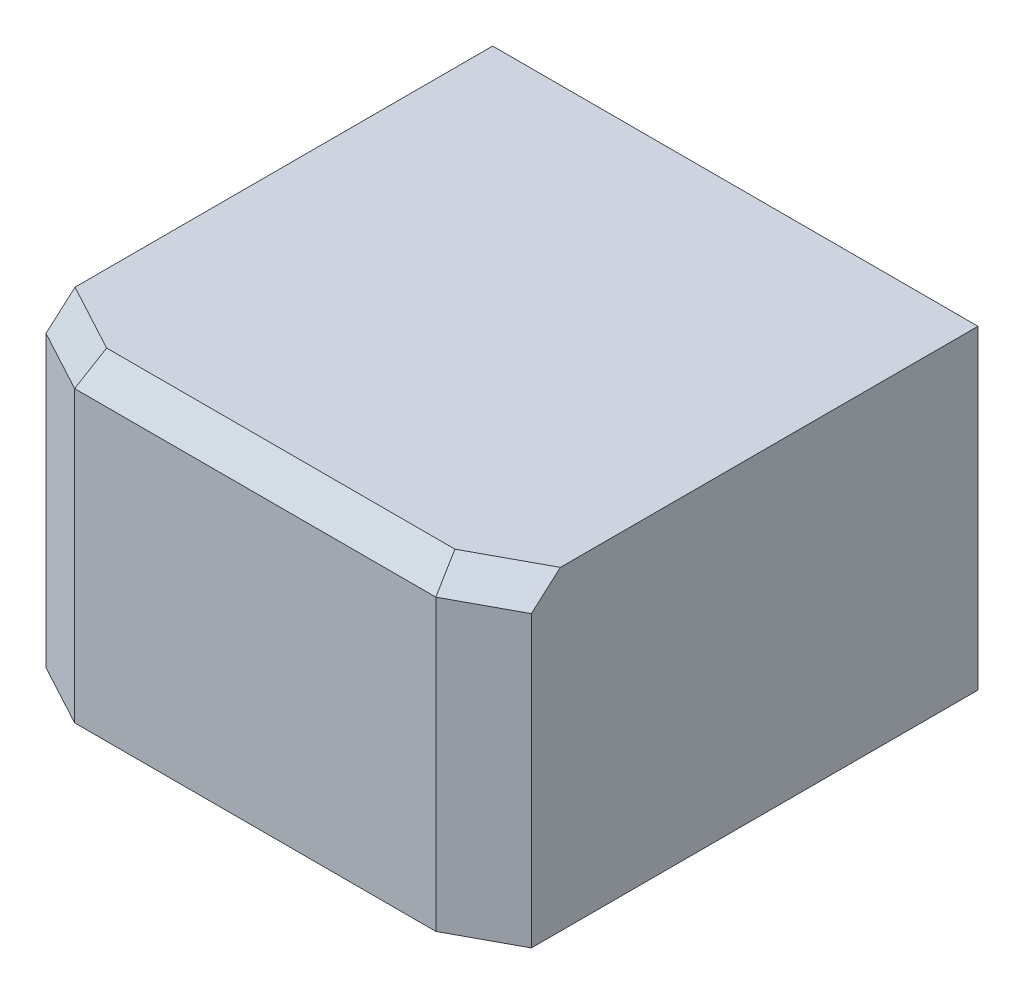
ISO-10303-21;
HEADER;
FILE_DESCRIPTION(('STEP AP214'),'2;1');
FILE_NAME('part.step','',(''),(''),'','','');
FILE_SCHEMA(('AUTOMOTIVE_DESIGN { 1 0 10303 214 1 1 1 1 }'));
ENDSEC;
DATA;
#1=APPLICATION_CONTEXT('core data for automotive mechanical design processes');
#2=APPLICATION_PROTOCOL_DEFINITION('international standard','automotive_design',2000,#1);
#3=PRODUCT_CONTEXT('',#1,'mechanical');
#4=PRODUCT('Part','Part','',(#3));
#5=PRODUCT_RELATED_PRODUCT_CATEGORY('part','',(#4));
#6=PRODUCT_DEFINITION_FORMATION('','',#4);
#7=PRODUCT_DEFINITION_CONTEXT('part definition',#1,'design');
#8=PRODUCT_DEFINITION('design','',#6,#7);
#9=PRODUCT_DEFINITION_SHAPE('','',#8);
#10=(LENGTH_UNIT() NAMED_UNIT(*) SI_UNIT(.MILLI.,.METRE.));
#11=(NAMED_UNIT(*) PLANE_ANGLE_UNIT() SI_UNIT($,.RADIAN.));
#12=(NAMED_UNIT(*) SI_UNIT($,.STERADIAN.) SOLID_ANGLE_UNIT());
#13=UNCERTAINTY_MEASURE_WITH_UNIT(LENGTH_MEASURE(1.E-05),#10,'distance_accuracy_value','');
#14=(GEOMETRIC_REPRESENTATION_CONTEXT(3) GLOBAL_UNCERTAINTY_ASSIGNED_CONTEXT((#13)) GLOBAL_UNIT_ASSIGNED_CONTEXT((#10,
#11,#12)) REPRESENTATION_CONTEXT('',''));
#15=CARTESIAN_POINT('',(0.,0.,0.));
#16=DIRECTION('',(0.,0.,1.));
#17=DIRECTION('',(1.,0.,0.));
#18=AXIS2_PLACEMENT_3D('',#15,#16,#17);
#19=CARTESIAN_POINT('',(-251.217376768848,50.,-262.26));
#20=DIRECTION('',(0.,-1.,0.));
#21=DIRECTION('',(0.,0.,-1.));
#22=AXIS2_PLACEMENT_3D('',#19,#20,#21);
#23=PLANE('',#22);
#24=DIRECTION('',(0.,0.,1.));
#25=VECTOR('',#24,1.);
#26=CARTESIAN_POINT('',(344.332453230351,50.,262.25));
#27=LINE('',#26,#25);
#28=CARTESIAN_POINT('',(344.332453230351,50.,-262.25));
#29=VERTEX_POINT('',#28);
#30=CARTESIAN_POINT('',(344.332453230351,50.,262.25));
#31=VERTEX_POINT('',#30);
#32=EDGE_CURVE('E294',#29,#31,#27,.T.);
#33=ORIENTED_EDGE('',*,*,#32,.T.);
#34=DIRECTION('',(-0.880291290313936,0.,0.474433603571064));
#35=VECTOR('',#34,1.);
#36=CARTESIAN_POINT('',(271.430398918615,50.,301.540612908956));
#37=LINE('',#36,#35);
#38=CARTESIAN_POINT('',(271.430398918615,50.,301.540612908956));
#39=VERTEX_POINT('',#38);
#40=EDGE_CURVE('E297',#31,#39,#37,.T.);
#41=ORIENTED_EDGE('',*,*,#40,.T.);
#42=DIRECTION('',(-1.,0.,0.));
#43=VECTOR('',#42,1.);
#44=CARTESIAN_POINT('',(-152.747945688264,50.,301.540612908956));
#45=LINE('',#44,#43);
#46=CARTESIAN_POINT('',(-152.747945688264,50.,301.540612908956));
#47=VERTEX_POINT('',#46);
#48=EDGE_CURVE('E212',#39,#47,#45,.T.);
#49=ORIENTED_EDGE('',*,*,#48,.T.);
#50=DIRECTION('',(-0.880291290313936,0.,-0.474433603571064));
#51=VECTOR('',#50,1.);
#52=CARTESIAN_POINT('',(-225.65,50.,262.25));
#53=LINE('',#52,#51);
#54=CARTESIAN_POINT('',(-225.65,50.,262.25));
#55=VERTEX_POINT('',#54);
#56=EDGE_CURVE('E209',#47,#55,#53,.T.);
#57=ORIENTED_EDGE('',*,*,#56,.T.);
#58=DIRECTION('',(0.,0.,-1.));
#59=VECTOR('',#58,1.);
#60=CARTESIAN_POINT('',(-225.65,50.,-262.25));
#61=LINE('',#60,#59);
#62=CARTESIAN_POINT('',(-225.65,50.,-262.25));
#63=VERTEX_POINT('',#62);
#64=EDGE_CURVE('E291',#55,#63,#61,.T.);
#65=ORIENTED_EDGE('',*,*,#64,.T.);
#66=DIRECTION('',(-1.,0.,0.));
#67=VECTOR('',#66,1.);
#68=CARTESIAN_POINT('',(-225.65,50.,-262.25));
#69=LINE('',#68,#67);
#70=EDGE_CURVE('E289',#29,#63,#69,.T.);
#71=ORIENTED_EDGE('',*,*,#70,.F.);
#72=EDGE_LOOP('',(#33,#41,#49,#57,#65,#71));
#73=FACE_BOUND('',#72,.T.);
#74=DIRECTION('',(0.,0.,1.));
#75=VECTOR('',#74,1.);
#76=CARTESIAN_POINT('',(341.152453230351,50.,262.25));
#77=LINE('',#76,#75);
#78=CARTESIAN_POINT('',(341.152453230351,50.,-259.07));
#79=VERTEX_POINT('',#78);
#80=CARTESIAN_POINT('',(341.152453230351,50.,260.351422609727));
#81=VERTEX_POINT('',#80);
#82=EDGE_CURVE('E188',#79,#81,#77,.T.);
#83=ORIENTED_EDGE('',*,*,#82,.F.);
#84=DIRECTION('',(-1.,0.,0.));
#85=VECTOR('',#84,1.);
#86=CARTESIAN_POINT('',(-225.65,50.,-259.07));
#87=LINE('',#86,#85);
#88=CARTESIAN_POINT('',(-222.47,50.,-259.07));
#89=VERTEX_POINT('',#88);
#90=EDGE_CURVE('E202',#79,#89,#87,.T.);
#91=ORIENTED_EDGE('',*,*,#90,.T.);
#92=DIRECTION('',(0.,0.,-1.));
#93=VECTOR('',#92,1.);
#94=CARTESIAN_POINT('',(-222.47,50.,-262.25));
#95=LINE('',#94,#93);
#96=CARTESIAN_POINT('',(-222.47,50.,260.351422609727));
#97=VERTEX_POINT('',#96);
#98=EDGE_CURVE('E205',#97,#89,#95,.T.);
#99=ORIENTED_EDGE('',*,*,#98,.F.);
#100=DIRECTION('',(-0.880291290313936,0.,-0.474433603571064));
#101=VECTOR('',#100,1.);
#102=CARTESIAN_POINT('',(-224.141301140644,50.,259.450673696802));
#103=LINE('',#102,#101);
#104=CARTESIAN_POINT('',(-151.945570616313,50.,298.360612908956));
#105=VERTEX_POINT('',#104);
#106=EDGE_CURVE('E281',#105,#97,#103,.T.);
#107=ORIENTED_EDGE('',*,*,#106,.F.);
#108=DIRECTION('',(-1.,0.,0.));
#109=VECTOR('',#108,1.);
#110=CARTESIAN_POINT('',(-152.747945688264,50.,298.360612908956));
#111=LINE('',#110,#109);
#112=CARTESIAN_POINT('',(270.628023846663,50.,298.360612908956));
#113=VERTEX_POINT('',#112);
#114=EDGE_CURVE('E284',#113,#105,#111,.T.);
#115=ORIENTED_EDGE('',*,*,#114,.F.);
#116=DIRECTION('',(-0.880291290313936,0.,0.474433603571064));
#117=VECTOR('',#116,1.);
#118=CARTESIAN_POINT('',(269.921700059259,50.,298.741286605758));
#119=LINE('',#118,#117);
#120=EDGE_CURVE('E204',#81,#113,#119,.T.);
#121=ORIENTED_EDGE('',*,*,#120,.F.);
#122=EDGE_LOOP('',(#83,#91,#99,#107,#115,#121));
#123=FACE_BOUND('',#122,.T.);
#124=ADVANCED_FACE('F33',(#73,#123),#23,.T.);
#125=CARTESIAN_POINT('',(-215.65,230.,120.89000000008));
#126=DIRECTION('',(0.,0.,1.));
#127=DIRECTION('',(1.,0.,0.));
#128=AXIS2_PLACEMENT_3D('',#125,#126,#127);
#129=PLANE('',#128);
#130=DIRECTION('',(0.,-1.,0.));
#131=VECTOR('',#130,1.);
#132=CARTESIAN_POINT('',(-222.47,370.,120.89000000008));
#133=LINE('',#132,#131);
#134=CARTESIAN_POINT('',(-222.47,315.,120.89000000008));
#135=VERTEX_POINT('',#134);
#136=CARTESIAN_POINT('',(-222.47,230.,120.89000000008));
#137=VERTEX_POINT('',#136);
#138=EDGE_CURVE('E679',#135,#137,#133,.T.);
#139=ORIENTED_EDGE('',*,*,#138,.T.);
#140=DIRECTION('',(-1.,0.,0.));
#141=VECTOR('',#140,1.);
#142=CARTESIAN_POINT('',(-215.65,230.,120.89000000008));
#143=LINE('',#142,#141);
#144=CARTESIAN_POINT('',(-225.65,230.,120.89000000008));
#145=VERTEX_POINT('',#144);
#146=EDGE_CURVE('E266',#137,#145,#143,.T.);
#147=ORIENTED_EDGE('',*,*,#146,.T.);
#148=DIRECTION('',(0.,1.,0.));
#149=VECTOR('',#148,1.);
#150=CARTESIAN_POINT('',(-225.65,230.,120.89000000008));
#151=LINE('',#150,#149);
#152=CARTESIAN_POINT('',(-225.65,315.,120.89000000008));
#153=VERTEX_POINT('',#152);
#154=EDGE_CURVE('E261',#145,#153,#151,.T.);
#155=ORIENTED_EDGE('',*,*,#154,.T.);
#156=DIRECTION('',(-1.,0.,0.));
#157=VECTOR('',#156,1.);
#158=CARTESIAN_POINT('',(-215.65,315.,120.89000000008));
#159=LINE('',#158,#157);
#160=EDGE_CURVE('E268',#135,#153,#159,.T.);
#161=ORIENTED_EDGE('',*,*,#160,.F.);
#162=EDGE_LOOP('',(#139,#147,#155,#161));
#163=FACE_BOUND('',#162,.T.);
#164=ADVANCED_FACE('F385',(#163),#129,.F.);
#165=CARTESIAN_POINT('',(-215.65,190.,80.8900000000801));
#166=DIRECTION('',(0.,-0.707106781186547,0.707106781186548));
#167=DIRECTION('',(0.,-0.707106781186548,-0.707106781186547));
#168=AXIS2_PLACEMENT_3D('',#165,#166,#167);
#169=PLANE('',#168);
#170=DIRECTION('',(0.,-0.707106781186548,-0.707106781186547));
#171=VECTOR('',#170,1.);
#172=CARTESIAN_POINT('',(-222.47,108.42999999996,-0.679999999959935));
#173=LINE('',#172,#171);
#174=CARTESIAN_POINT('',(-222.47,190.,80.8900000000801));
#175=VERTEX_POINT('',#174);
#176=EDGE_CURVE('E642',#137,#175,#173,.T.);
#177=ORIENTED_EDGE('',*,*,#176,.T.);
#178=DIRECTION('',(-1.,0.,0.));
#179=VECTOR('',#178,1.);
#180=CARTESIAN_POINT('',(-215.65,190.,80.8900000000801));
#181=LINE('',#180,#179);
#182=CARTESIAN_POINT('',(-225.65,190.,80.8900000000801));
#183=VERTEX_POINT('',#182);
#184=EDGE_CURVE('E264',#175,#183,#181,.T.);
#185=ORIENTED_EDGE('',*,*,#184,.T.);
#186=DIRECTION('',(0.,0.707106781186548,0.707106781186547));
#187=VECTOR('',#186,1.);
#188=CARTESIAN_POINT('',(-225.65,190.,80.8900000000801));
#189=LINE('',#188,#187);
#190=EDGE_CURVE('E273',#183,#145,#189,.T.);
#191=ORIENTED_EDGE('',*,*,#190,.T.);
#192=ORIENTED_EDGE('',*,*,#146,.F.);
#193=EDGE_LOOP('',(#177,#185,#191,#192));
#194=FACE_BOUND('',#193,.T.);
#195=ADVANCED_FACE('F387',(#194),#169,.F.);
#196=CARTESIAN_POINT('',(-215.65,190.,20.8900000000801));
#197=DIRECTION('',(0.,-1.,0.));
#198=DIRECTION('',(0.,0.,-1.));
#199=AXIS2_PLACEMENT_3D('',#196,#197,#198);
#200=PLANE('',#199);
#201=DIRECTION('',(0.,0.,-1.));
#202=VECTOR('',#201,1.);
#203=CARTESIAN_POINT('',(-222.47,190.,-262.25));
#204=LINE('',#203,#202);
#205=CARTESIAN_POINT('',(-222.47,190.,20.8900000000801));
#206=VERTEX_POINT('',#205);
#207=EDGE_CURVE('E638',#175,#206,#204,.T.);
#208=ORIENTED_EDGE('',*,*,#207,.T.);
#209=DIRECTION('',(-1.,0.,0.));
#210=VECTOR('',#209,1.);
#211=CARTESIAN_POINT('',(-215.65,190.,20.8900000000801));
#212=LINE('',#211,#210);
#213=CARTESIAN_POINT('',(-225.65,190.,20.8900000000801));
#214=VERTEX_POINT('',#213);
#215=EDGE_CURVE('E58',#206,#214,#212,.T.);
#216=ORIENTED_EDGE('',*,*,#215,.T.);
#217=DIRECTION('',(0.,0.,1.));
#218=VECTOR('',#217,1.);
#219=CARTESIAN_POINT('',(-225.65,190.,20.8900000000801));
#220=LINE('',#219,#218);
#221=EDGE_CURVE('E276',#214,#183,#220,.T.);
#222=ORIENTED_EDGE('',*,*,#221,.T.);
#223=ORIENTED_EDGE('',*,*,#184,.F.);
#224=EDGE_LOOP('',(#208,#216,#222,#223));
#225=FACE_BOUND('',#224,.T.);
#226=ADVANCED_FACE('F394',(#225),#200,.F.);
#227=CARTESIAN_POINT('',(-215.65,230.,-19.1099999999199));
#228=DIRECTION('',(0.,-0.707106781186547,-0.707106781186548));
#229=DIRECTION('',(0.,0.707106781186548,-0.707106781186547));
#230=AXIS2_PLACEMENT_3D('',#227,#228,#229);
#231=PLANE('',#230);
#232=DIRECTION('',(0.,0.707106781186548,-0.707106781186547));
#233=VECTOR('',#232,1.);
#234=CARTESIAN_POINT('',(-222.47,421.57000000004,-210.67999999996));
#235=LINE('',#234,#233);
#236=CARTESIAN_POINT('',(-222.47,230.,-19.1099999999199));
#237=VERTEX_POINT('',#236);
#238=EDGE_CURVE('E641',#206,#237,#235,.T.);
#239=ORIENTED_EDGE('',*,*,#238,.T.);
#240=DIRECTION('',(-1.,0.,0.));
#241=VECTOR('',#240,1.);
#242=CARTESIAN_POINT('',(-215.65,230.,-19.1099999999199));
#243=LINE('',#242,#241);
#244=CARTESIAN_POINT('',(-225.65,230.,-19.1099999999199));
#245=VERTEX_POINT('',#244);
#246=EDGE_CURVE('E50',#237,#245,#243,.T.);
#247=ORIENTED_EDGE('',*,*,#246,.T.);
#248=DIRECTION('',(0.,-0.707106781186548,0.707106781186547));
#249=VECTOR('',#248,1.);
#250=CARTESIAN_POINT('',(-225.65,230.,-19.1099999999199));
#251=LINE('',#250,#249);
#252=EDGE_CURVE('E278',#245,#214,#251,.T.);
#253=ORIENTED_EDGE('',*,*,#252,.T.);
#254=ORIENTED_EDGE('',*,*,#215,.F.);
#255=EDGE_LOOP('',(#239,#247,#253,#254));
#256=FACE_BOUND('',#255,.T.);
#257=ADVANCED_FACE('F600',(#256),#231,.F.);
#258=CARTESIAN_POINT('',(-215.65,315.,-19.1099999999199));
#259=DIRECTION('',(0.,0.,-1.));
#260=DIRECTION('',(-1.,0.,0.));
#261=AXIS2_PLACEMENT_3D('',#258,#259,#260);
#262=PLANE('',#261);
#263=DIRECTION('',(0.,1.,0.));
#264=VECTOR('',#263,1.);
#265=CARTESIAN_POINT('',(-222.47,370.,-19.1099999999199));
#266=LINE('',#265,#264);
#267=CARTESIAN_POINT('',(-222.47,315.,-19.1099999999199));
#268=VERTEX_POINT('',#267);
#269=EDGE_CURVE('E648',#237,#268,#266,.T.);
#270=ORIENTED_EDGE('',*,*,#269,.T.);
#271=DIRECTION('',(-1.,0.,0.));
#272=VECTOR('',#271,1.);
#273=CARTESIAN_POINT('',(-215.65,315.,-19.1099999999199));
#274=LINE('',#273,#272);
#275=CARTESIAN_POINT('',(-225.65,315.,-19.1099999999199));
#276=VERTEX_POINT('',#275);
#277=EDGE_CURVE('E258',#268,#276,#274,.T.);
#278=ORIENTED_EDGE('',*,*,#277,.T.);
#279=DIRECTION('',(0.,-1.,0.));
#280=VECTOR('',#279,1.);
#281=CARTESIAN_POINT('',(-225.65,315.,-19.1099999999199));
#282=LINE('',#281,#280);
#283=EDGE_CURVE('E42',#276,#245,#282,.T.);
#284=ORIENTED_EDGE('',*,*,#283,.T.);
#285=ORIENTED_EDGE('',*,*,#246,.F.);
#286=EDGE_LOOP('',(#270,#278,#284,#285));
#287=FACE_BOUND('',#286,.T.);
#288=ADVANCED_FACE('F590',(#287),#262,.F.);
#289=CARTESIAN_POINT('',(-215.65,315.,120.89000000008));
#290=DIRECTION('',(0.,1.,0.));
#291=DIRECTION('',(0.,0.,1.));
#292=AXIS2_PLACEMENT_3D('',#289,#290,#291);
#293=PLANE('',#292);
#294=DIRECTION('',(0.,0.,1.));
#295=VECTOR('',#294,1.);
#296=CARTESIAN_POINT('',(-222.47,315.,-262.25));
#297=LINE('',#296,#295);
#298=EDGE_CURVE('E283',#268,#135,#297,.T.);
#299=ORIENTED_EDGE('',*,*,#298,.T.);
#300=ORIENTED_EDGE('',*,*,#160,.T.);
#301=DIRECTION('',(0.,0.,-1.));
#302=VECTOR('',#301,1.);
#303=CARTESIAN_POINT('',(-225.65,315.,120.89000000008));
#304=LINE('',#303,#302);
#305=EDGE_CURVE('E11',#153,#276,#304,.T.);
#306=ORIENTED_EDGE('',*,*,#305,.T.);
#307=ORIENTED_EDGE('',*,*,#277,.F.);
#308=EDGE_LOOP('',(#299,#300,#306,#307));
#309=FACE_BOUND('',#308,.T.);
#310=ADVANCED_FACE('F581',(#309),#293,.F.);
#311=CARTESIAN_POINT('',(0.,416.82,0.));
#312=DIRECTION('',(0.,1.,0.));
#313=DIRECTION('',(0.,0.,1.));
#314=AXIS2_PLACEMENT_3D('',#311,#312,#313);
#315=PLANE('',#314);
#316=DIRECTION('',(1.,0.,0.));
#317=VECTOR('',#316,1.);
#318=CARTESIAN_POINT('',(0.,416.82,270.223413780609));
#319=LINE('',#318,#317);
#320=CARTESIAN_POINT('',(-144.846014900863,416.82,270.223413780609));
#321=VERTEX_POINT('',#320);
#322=CARTESIAN_POINT('',(263.528468131214,416.82,270.223413780609));
#323=VERTEX_POINT('',#322);
#324=EDGE_CURVE('E237',#321,#323,#319,.T.);
#325=ORIENTED_EDGE('',*,*,#324,.F.);
#326=DIRECTION('',(0.880291290313936,0.,0.474433603571064));
#327=VECTOR('',#326,1.);
#328=CARTESIAN_POINT('',(-145.459034451835,416.82,269.89302646697));
#329=LINE('',#328,#327);
#330=CARTESIAN_POINT('',(-222.47,416.82,228.387912987461));
#331=VERTEX_POINT('',#330);
#332=EDGE_CURVE('E344',#331,#321,#329,.T.);
#333=ORIENTED_EDGE('',*,*,#332,.F.);
#334=DIRECTION('',(0.,0.,1.));
#335=VECTOR('',#334,1.);
#336=CARTESIAN_POINT('',(-222.47,416.82,-262.25));
#337=LINE('',#336,#335);
#338=CARTESIAN_POINT('',(-222.47,416.82,-259.07));
#339=VERTEX_POINT('',#338);
#340=EDGE_CURVE('E247',#339,#331,#337,.T.);
#341=ORIENTED_EDGE('',*,*,#340,.F.);
#342=DIRECTION('',(-1.,0.,0.));
#343=VECTOR('',#342,1.);
#344=CARTESIAN_POINT('',(0.,416.82,-259.07));
#345=LINE('',#344,#343);
#346=CARTESIAN_POINT('',(341.152453230351,416.82,-259.07));
#347=VERTEX_POINT('',#346);
#348=EDGE_CURVE('E241',#347,#339,#345,.T.);
#349=ORIENTED_EDGE('',*,*,#348,.F.);
#350=DIRECTION('',(0.,0.,-1.));
#351=VECTOR('',#350,1.);
#352=CARTESIAN_POINT('',(341.152453230351,416.82,262.25));
#353=LINE('',#352,#351);
#354=CARTESIAN_POINT('',(341.152453230351,416.82,228.387912987461));
#355=VERTEX_POINT('',#354);
#356=EDGE_CURVE('E191',#355,#347,#353,.T.);
#357=ORIENTED_EDGE('',*,*,#356,.F.);
#358=DIRECTION('',(0.880291290313936,0.,-0.474433603571064));
#359=VECTOR('',#358,1.);
#360=CARTESIAN_POINT('',(172.172940784044,416.82,319.459538825077));
#361=LINE('',#360,#359);
#362=EDGE_CURVE('E346',#323,#355,#361,.T.);
#363=ORIENTED_EDGE('',*,*,#362,.F.);
#364=EDGE_LOOP('',(#325,#333,#341,#349,#357,#363));
#365=FACE_BOUND('',#364,.T.);
#366=ADVANCED_FACE('F365',(#365),#315,.F.);
#367=CARTESIAN_POINT('',(171.731053118907,417.751400435827,318.639635133624));
#368=DIRECTION('',(0.335475218307871,0.707106781186544,0.622459940800443));
#369=DIRECTION('',(-0.880291290313936,0.,0.474433603571064));
#370=AXIS2_PLACEMENT_3D('',#367,#368,#369);
#371=PLANE('',#370);
#372=DIRECTION('',(0.175642945024069,-0.696114055260803,0.696114055260797));
#373=VECTOR('',#372,1.);
#374=CARTESIAN_POINT('',(266.502328528714,405.033895976297,282.009517804312));
#375=LINE('',#374,#373);
#376=CARTESIAN_POINT('',(270.628023846663,388.682800871653,298.360612908956));
#377=VERTEX_POINT('',#376);
#378=EDGE_CURVE('E270',#323,#377,#375,.T.);
#379=ORIENTED_EDGE('',*,*,#378,.F.);
#380=ORIENTED_EDGE('',*,*,#362,.T.);
#381=DIRECTION('',(0.,-0.660751107356155,0.750605072010319));
#382=VECTOR('',#381,1.);
#383=CARTESIAN_POINT('',(341.152453230351,372.465115172424,278.774512645578));
#384=LINE('',#383,#382);
#385=CARTESIAN_POINT('',(341.152453230351,388.682800871653,260.351422609727));
#386=VERTEX_POINT('',#385);
#387=EDGE_CURVE('E338',#355,#386,#384,.T.);
#388=ORIENTED_EDGE('',*,*,#387,.T.);
#389=DIRECTION('',(-0.880291290313936,0.,0.474433603571064));
#390=VECTOR('',#389,1.);
#391=CARTESIAN_POINT('',(185.522173560902,388.682800871653,344.228470151589));
#392=LINE('',#391,#390);
#393=EDGE_CURVE('E336',#386,#377,#392,.T.);
#394=ORIENTED_EDGE('',*,*,#393,.T.);
#395=EDGE_LOOP('',(#379,#380,#388,#394));
#396=FACE_BOUND('',#395,.T.);
#397=ADVANCED_FACE('F351',(#396),#371,.F.);
#398=CARTESIAN_POINT('',(341.152453230351,370.,262.25));
#399=DIRECTION('',(-1.,0.,0.));
#400=DIRECTION('',(0.,0.,1.));
#401=AXIS2_PLACEMENT_3D('',#398,#399,#400);
#402=PLANE('',#401);
#403=DIRECTION('',(0.,-1.,0.));
#404=VECTOR('',#403,1.);
#405=CARTESIAN_POINT('',(341.152453230351,370.,-259.07));
#406=LINE('',#405,#404);
#407=EDGE_CURVE('E184',#347,#79,#406,.T.);
#408=ORIENTED_EDGE('',*,*,#407,.T.);
#409=ORIENTED_EDGE('',*,*,#82,.T.);
#410=DIRECTION('',(0.,-1.,0.));
#411=VECTOR('',#410,1.);
#412=CARTESIAN_POINT('',(341.152453230351,370.,260.351422609727));
#413=LINE('',#412,#411);
#414=EDGE_CURVE('E197',#386,#81,#413,.T.);
#415=ORIENTED_EDGE('',*,*,#414,.F.);
#416=ORIENTED_EDGE('',*,*,#387,.F.);
#417=ORIENTED_EDGE('',*,*,#356,.T.);
#418=EDGE_LOOP('',(#408,#409,#415,#416,#417));
#419=FACE_BOUND('',#418,.T.);
#420=ADVANCED_FACE('F186',(#419),#402,.T.);
#421=CARTESIAN_POINT('',(0.,417.751400435827,269.292013344783));
#422=DIRECTION('',(0.,0.707106781186544,0.707106781186551));
#423=DIRECTION('',(-1.,0.,0.));
#424=AXIS2_PLACEMENT_3D('',#421,#422,#423);
#425=PLANE('',#424);
#426=DIRECTION('',(-0.175642945024068,-0.696114055260803,0.696114055260797));
#427=VECTOR('',#426,1.);
#428=CARTESIAN_POINT('',(-140.149690961804,435.432629739207,251.610784041402));
#429=LINE('',#428,#427);
#430=CARTESIAN_POINT('',(-151.945570616313,388.682800871653,298.360612908956));
#431=VERTEX_POINT('',#430);
#432=EDGE_CURVE('E246',#321,#431,#429,.T.);
#433=ORIENTED_EDGE('',*,*,#432,.F.);
#434=ORIENTED_EDGE('',*,*,#324,.T.);
#435=ORIENTED_EDGE('',*,*,#378,.T.);
#436=DIRECTION('',(-1.,0.,0.));
#437=VECTOR('',#436,1.);
#438=CARTESIAN_POINT('',(0.,388.682800871653,298.360612908956));
#439=LINE('',#438,#437);
#440=EDGE_CURVE('E257',#377,#431,#439,.T.);
#441=ORIENTED_EDGE('',*,*,#440,.T.);
#442=EDGE_LOOP('',(#433,#434,#435,#441));
#443=FACE_BOUND('',#442,.T.);
#444=ADVANCED_FACE('F362',(#443),#425,.F.);
#445=CARTESIAN_POINT('',(269.921700059259,991.335058659321,298.741286605758));
#446=DIRECTION('',(-0.474433603571064,0.,-0.880291290313936));
#447=DIRECTION('',(-0.880291290313936,0.,0.474433603571064));
#448=AXIS2_PLACEMENT_3D('',#445,#446,#447);
#449=PLANE('',#448);
#450=ORIENTED_EDGE('',*,*,#414,.T.);
#451=ORIENTED_EDGE('',*,*,#120,.T.);
#452=DIRECTION('',(0.,-1.,0.));
#453=VECTOR('',#452,1.);
#454=CARTESIAN_POINT('',(270.628023846663,991.335058659321,298.360612908956));
#455=LINE('',#454,#453);
#456=EDGE_CURVE('E37',#377,#113,#455,.T.);
#457=ORIENTED_EDGE('',*,*,#456,.F.);
#458=ORIENTED_EDGE('',*,*,#393,.F.);
#459=EDGE_LOOP('',(#450,#451,#457,#458));
#460=FACE_BOUND('',#459,.T.);
#461=ADVANCED_FACE('F356',(#460),#449,.T.);
#462=CARTESIAN_POINT('',(-145.017146786698,417.751400435827,269.073122775517));
#463=DIRECTION('',(-0.335475218307871,0.707106781186544,0.622459940800443));
#464=DIRECTION('',(-0.880291290313936,0.,-0.474433603571064));
#465=AXIS2_PLACEMENT_3D('',#462,#463,#464);
#466=PLANE('',#465);
#467=DIRECTION('',(0.,0.660751107356155,-0.750605072010319));
#468=VECTOR('',#467,1.);
#469=CARTESIAN_POINT('',(-222.47,397.048277909541,250.848344333326));
#470=LINE('',#469,#468);
#471=CARTESIAN_POINT('',(-222.47,388.682800871653,260.351422609727));
#472=VERTEX_POINT('',#471);
#473=EDGE_CURVE('E254',#472,#331,#470,.T.);
#474=ORIENTED_EDGE('',*,*,#473,.T.);
#475=ORIENTED_EDGE('',*,*,#332,.T.);
#476=ORIENTED_EDGE('',*,*,#432,.T.);
#477=DIRECTION('',(-0.880291290313936,0.,-0.474433603571064));
#478=VECTOR('',#477,1.);
#479=CARTESIAN_POINT('',(-158.808267228693,388.682800871653,294.661957793482));
#480=LINE('',#479,#478);
#481=EDGE_CURVE('E256',#431,#472,#480,.T.);
#482=ORIENTED_EDGE('',*,*,#481,.T.);
#483=EDGE_LOOP('',(#474,#475,#476,#482));
#484=FACE_BOUND('',#483,.T.);
#485=ADVANCED_FACE('F373',(#484),#466,.F.);
#486=CARTESIAN_POINT('',(-222.47,370.,-262.25));
#487=DIRECTION('',(1.,0.,0.));
#488=DIRECTION('',(0.,0.,-1.));
#489=AXIS2_PLACEMENT_3D('',#486,#487,#488);
#490=PLANE('',#489);
#491=ORIENTED_EDGE('',*,*,#298,.F.);
#492=ORIENTED_EDGE('',*,*,#269,.F.);
#493=ORIENTED_EDGE('',*,*,#238,.F.);
#494=ORIENTED_EDGE('',*,*,#207,.F.);
#495=ORIENTED_EDGE('',*,*,#176,.F.);
#496=ORIENTED_EDGE('',*,*,#138,.F.);
#497=EDGE_LOOP('',(#491,#492,#493,#494,#495,#496));
#498=FACE_BOUND('',#497,.T.);
#499=DIRECTION('',(0.,-1.,0.));
#500=VECTOR('',#499,1.);
#501=CARTESIAN_POINT('',(-222.47,991.335058659321,260.351422609727));
#502=LINE('',#501,#500);
#503=EDGE_CURVE('E234',#472,#97,#502,.T.);
#504=ORIENTED_EDGE('',*,*,#503,.T.);
#505=ORIENTED_EDGE('',*,*,#98,.T.);
#506=DIRECTION('',(0.,-1.,0.));
#507=VECTOR('',#506,1.);
#508=CARTESIAN_POINT('',(-222.47,370.,-259.07));
#509=LINE('',#508,#507);
#510=EDGE_CURVE('E196',#339,#89,#509,.T.);
#511=ORIENTED_EDGE('',*,*,#510,.F.);
#512=ORIENTED_EDGE('',*,*,#340,.T.);
#513=ORIENTED_EDGE('',*,*,#473,.F.);
#514=EDGE_LOOP('',(#504,#505,#511,#512,#513));
#515=FACE_BOUND('',#514,.T.);
#516=ADVANCED_FACE('F370',(#498,#515),#490,.T.);
#517=CARTESIAN_POINT('',(-152.747945688264,991.335058659321,298.360612908956));
#518=DIRECTION('',(0.,0.,-1.));
#519=DIRECTION('',(-1.,0.,0.));
#520=AXIS2_PLACEMENT_3D('',#517,#518,#519);
#521=PLANE('',#520);
#522=ORIENTED_EDGE('',*,*,#456,.T.);
#523=ORIENTED_EDGE('',*,*,#114,.T.);
#524=DIRECTION('',(0.,-1.,0.));
#525=VECTOR('',#524,1.);
#526=CARTESIAN_POINT('',(-151.945570616313,991.335058659321,298.360612908956));
#527=LINE('',#526,#525);
#528=EDGE_CURVE('E239',#431,#105,#527,.T.);
#529=ORIENTED_EDGE('',*,*,#528,.F.);
#530=ORIENTED_EDGE('',*,*,#440,.F.);
#531=EDGE_LOOP('',(#522,#523,#529,#530));
#532=FACE_BOUND('',#531,.T.);
#533=ADVANCED_FACE('F359',(#532),#521,.T.);
#534=CARTESIAN_POINT('',(-224.141301140644,991.335058659321,259.450673696802));
#535=DIRECTION('',(0.474433603571064,0.,-0.880291290313936));
#536=DIRECTION('',(-0.880291290313936,0.,-0.474433603571064));
#537=AXIS2_PLACEMENT_3D('',#534,#535,#536);
#538=PLANE('',#537);
#539=ORIENTED_EDGE('',*,*,#528,.T.);
#540=ORIENTED_EDGE('',*,*,#106,.T.);
#541=ORIENTED_EDGE('',*,*,#503,.F.);
#542=ORIENTED_EDGE('',*,*,#481,.F.);
#543=EDGE_LOOP('',(#539,#540,#541,#542));
#544=FACE_BOUND('',#543,.T.);
#545=ADVANCED_FACE('F35',(#544),#538,.T.);
#546=CARTESIAN_POINT('',(-225.65,370.,-259.07));
#547=DIRECTION('',(0.,0.,-1.));
#548=DIRECTION('',(-1.,0.,0.));
#549=AXIS2_PLACEMENT_3D('',#546,#547,#548);
#550=PLANE('',#549);
#551=ORIENTED_EDGE('',*,*,#90,.F.);
#552=ORIENTED_EDGE('',*,*,#407,.F.);
#553=ORIENTED_EDGE('',*,*,#348,.T.);
#554=ORIENTED_EDGE('',*,*,#510,.T.);
#555=EDGE_LOOP('',(#551,#552,#553,#554));
#556=FACE_BOUND('',#555,.T.);
#557=ADVANCED_FACE('F207',(#556),#550,.F.);
#558=CARTESIAN_POINT('',(0.,420.,0.));
#559=DIRECTION('',(0.,1.,0.));
#560=DIRECTION('',(0.,0.,1.));
#561=AXIS2_PLACEMENT_3D('',#558,#559,#560);
#562=PLANE('',#561);
#563=DIRECTION('',(1.,0.,0.));
#564=VECTOR('',#563,1.);
#565=CARTESIAN_POINT('',(271.430398918615,420.,271.540612908956));
#566=LINE('',#565,#564);
#567=CARTESIAN_POINT('',(-145.178369537776,420.,271.540612908956));
#568=VERTEX_POINT('',#567);
#569=CARTESIAN_POINT('',(263.860822768126,420.,271.540612908956));
#570=VERTEX_POINT('',#569);
#571=EDGE_CURVE('E219',#568,#570,#566,.T.);
#572=ORIENTED_EDGE('',*,*,#571,.T.);
#573=DIRECTION('',(0.880291290313936,0.,-0.474433603571064));
#574=VECTOR('',#573,1.);
#575=CARTESIAN_POINT('',(330.099445123219,420.,235.841261290582));
#576=LINE('',#575,#574);
#577=CARTESIAN_POINT('',(344.332453230351,420.,228.170371665496));
#578=VERTEX_POINT('',#577);
#579=EDGE_CURVE('E666',#570,#578,#576,.T.);
#580=ORIENTED_EDGE('',*,*,#579,.T.);
#581=DIRECTION('',(0.,0.,-1.));
#582=VECTOR('',#581,1.);
#583=CARTESIAN_POINT('',(344.332453230351,420.,262.25));
#584=LINE('',#583,#582);
#585=CARTESIAN_POINT('',(344.332453230351,420.,-262.25));
#586=VERTEX_POINT('',#585);
#587=EDGE_CURVE('E227',#578,#586,#584,.T.);
#588=ORIENTED_EDGE('',*,*,#587,.T.);
#589=DIRECTION('',(-1.,0.,0.));
#590=VECTOR('',#589,1.);
#591=CARTESIAN_POINT('',(344.332453230351,420.,-262.25));
#592=LINE('',#591,#590);
#593=CARTESIAN_POINT('',(-225.65,420.,-262.25));
#594=VERTEX_POINT('',#593);
#595=EDGE_CURVE('E231',#586,#594,#592,.T.);
#596=ORIENTED_EDGE('',*,*,#595,.T.);
#597=DIRECTION('',(0.,0.,1.));
#598=VECTOR('',#597,1.);
#599=CARTESIAN_POINT('',(-225.65,420.,-262.25));
#600=LINE('',#599,#598);
#601=CARTESIAN_POINT('',(-225.65,420.,228.170371665496));
#602=VERTEX_POINT('',#601);
#603=EDGE_CURVE('E329',#594,#602,#600,.T.);
#604=ORIENTED_EDGE('',*,*,#603,.T.);
#605=DIRECTION('',(0.880291290313936,0.,0.474433603571064));
#606=VECTOR('',#605,1.);
#607=CARTESIAN_POINT('',(-138.514937581133,420.,275.131874199538));
#608=LINE('',#607,#606);
#609=EDGE_CURVE('E669',#602,#568,#608,.T.);
#610=ORIENTED_EDGE('',*,*,#609,.T.);
#611=EDGE_LOOP('',(#572,#580,#588,#596,#604,#610));
#612=FACE_BOUND('',#611,.T.);
#613=ADVANCED_FACE('F422',(#612),#562,.T.);
#614=CARTESIAN_POINT('',(172.797864313127,420.,320.619057745369));
#615=DIRECTION('',(0.335475218307871,0.707106781186544,0.622459940800443));
#616=DIRECTION('',(-0.880291290313936,0.,0.474433603571064));
#617=AXIS2_PLACEMENT_3D('',#614,#615,#616);
#618=PLANE('',#617);
#619=DIRECTION('',(-0.175642945024069,0.696114055260803,-0.696114055260797));
#620=VECTOR('',#619,1.);
#621=CARTESIAN_POINT('',(255.720599195447,452.261609147642,239.279003761314));
#622=LINE('',#621,#620);
#623=CARTESIAN_POINT('',(271.430398918615,390.,301.540612908956));
#624=VERTEX_POINT('',#623);
#625=EDGE_CURVE('E340',#570,#624,#622,.F.);
#626=ORIENTED_EDGE('',*,*,#625,.T.);
#627=DIRECTION('',(-0.880291290313936,0.,0.474433603571064));
#628=VECTOR('',#627,1.);
#629=CARTESIAN_POINT('',(271.430398918615,390.,301.540612908956));
#630=LINE('',#629,#628);
#631=CARTESIAN_POINT('',(344.332453230351,390.,262.25));
#632=VERTEX_POINT('',#631);
#633=EDGE_CURVE('E662',#632,#624,#630,.T.);
#634=ORIENTED_EDGE('',*,*,#633,.F.);
#635=DIRECTION('',(0.,-0.660751107356155,0.750605072010319));
#636=VECTOR('',#635,1.);
#637=CARTESIAN_POINT('',(344.332453230351,374.148860054656,280.256698600517));
#638=LINE('',#637,#636);
#639=EDGE_CURVE('E664',#578,#632,#638,.T.);
#640=ORIENTED_EDGE('',*,*,#639,.F.);
#641=ORIENTED_EDGE('',*,*,#579,.F.);
#642=EDGE_LOOP('',(#626,#634,#640,#641));
#643=FACE_BOUND('',#642,.T.);
#644=ADVANCED_FACE('F408',(#643),#618,.T.);
#645=CARTESIAN_POINT('',(344.332453230351,370.,262.25));
#646=DIRECTION('',(-1.,0.,0.));
#647=DIRECTION('',(0.,0.,1.));
#648=AXIS2_PLACEMENT_3D('',#645,#646,#647);
#649=PLANE('',#648);
#650=ORIENTED_EDGE('',*,*,#32,.F.);
#651=DIRECTION('',(0.,-1.,0.));
#652=VECTOR('',#651,1.);
#653=CARTESIAN_POINT('',(344.332453230351,370.,-262.25));
#654=LINE('',#653,#652);
#655=EDGE_CURVE('E221',#586,#29,#654,.T.);
#656=ORIENTED_EDGE('',*,*,#655,.F.);
#657=ORIENTED_EDGE('',*,*,#587,.F.);
#658=ORIENTED_EDGE('',*,*,#639,.T.);
#659=DIRECTION('',(0.,-1.,0.));
#660=VECTOR('',#659,1.);
#661=CARTESIAN_POINT('',(344.332453230351,370.,262.25));
#662=LINE('',#661,#660);
#663=EDGE_CURVE('E218',#632,#31,#662,.T.);
#664=ORIENTED_EDGE('',*,*,#663,.T.);
#665=EDGE_LOOP('',(#650,#656,#657,#658,#664));
#666=FACE_BOUND('',#665,.T.);
#667=ADVANCED_FACE('F321',(#666),#649,.F.);
#668=CARTESIAN_POINT('',(0.,420.,271.540612908956));
#669=DIRECTION('',(0.,0.707106781186544,0.707106781186551));
#670=DIRECTION('',(-1.,0.,0.));
#671=AXIS2_PLACEMENT_3D('',#668,#669,#670);
#672=PLANE('',#671);
#673=DIRECTION('',(-0.175642945024068,-0.696114055260803,0.696114055260797));
#674=VECTOR('',#673,1.);
#675=CARTESIAN_POINT('',(-140.699552358489,437.750599598621,253.790013310335));
#676=LINE('',#675,#674);
#677=CARTESIAN_POINT('',(-152.747945688264,390.,301.540612908956));
#678=VERTEX_POINT('',#677);
#679=EDGE_CURVE('E233',#568,#678,#676,.T.);
#680=ORIENTED_EDGE('',*,*,#679,.T.);
#681=DIRECTION('',(-1.,0.,0.));
#682=VECTOR('',#681,1.);
#683=CARTESIAN_POINT('',(-152.747945688264,390.,301.540612908956));
#684=LINE('',#683,#682);
#685=EDGE_CURVE('E650',#624,#678,#684,.T.);
#686=ORIENTED_EDGE('',*,*,#685,.F.);
#687=ORIENTED_EDGE('',*,*,#625,.F.);
#688=ORIENTED_EDGE('',*,*,#571,.F.);
#689=EDGE_LOOP('',(#680,#686,#687,#688));
#690=FACE_BOUND('',#689,.T.);
#691=ADVANCED_FACE('F407',(#690),#672,.T.);
#692=CARTESIAN_POINT('',(271.430398918615,991.335058659321,301.540612908956));
#693=DIRECTION('',(-0.474433603571064,0.,-0.880291290313936));
#694=DIRECTION('',(-0.880291290313936,0.,0.474433603571064));
#695=AXIS2_PLACEMENT_3D('',#692,#693,#694);
#696=PLANE('',#695);
#697=ORIENTED_EDGE('',*,*,#40,.F.);
#698=ORIENTED_EDGE('',*,*,#663,.F.);
#699=ORIENTED_EDGE('',*,*,#633,.T.);
#700=DIRECTION('',(0.,-1.,0.));
#701=VECTOR('',#700,1.);
#702=CARTESIAN_POINT('',(271.430398918615,991.335058659321,301.540612908956));
#703=LINE('',#702,#701);
#704=EDGE_CURVE('E230',#624,#39,#703,.T.);
#705=ORIENTED_EDGE('',*,*,#704,.T.);
#706=EDGE_LOOP('',(#697,#698,#699,#705));
#707=FACE_BOUND('',#706,.T.);
#708=ADVANCED_FACE('F403',(#707),#696,.F.);
#709=CARTESIAN_POINT('',(-225.65,370.,-262.25));
#710=DIRECTION('',(1.,0.,0.));
#711=DIRECTION('',(0.,0.,-1.));
#712=AXIS2_PLACEMENT_3D('',#709,#710,#711);
#713=PLANE('',#712);
#714=ORIENTED_EDGE('',*,*,#283,.F.);
#715=ORIENTED_EDGE('',*,*,#305,.F.);
#716=ORIENTED_EDGE('',*,*,#154,.F.);
#717=ORIENTED_EDGE('',*,*,#190,.F.);
#718=ORIENTED_EDGE('',*,*,#221,.F.);
#719=ORIENTED_EDGE('',*,*,#252,.F.);
#720=EDGE_LOOP('',(#714,#715,#716,#717,#718,#719));
#721=FACE_BOUND('',#720,.T.);
#722=ORIENTED_EDGE('',*,*,#64,.F.);
#723=DIRECTION('',(0.,-1.,0.));
#724=VECTOR('',#723,1.);
#725=CARTESIAN_POINT('',(-225.65,370.,262.25));
#726=LINE('',#725,#724);
#727=CARTESIAN_POINT('',(-225.65,390.,262.25));
#728=VERTEX_POINT('',#727);
#729=EDGE_CURVE('E216',#728,#55,#726,.T.);
#730=ORIENTED_EDGE('',*,*,#729,.F.);
#731=DIRECTION('',(0.,0.660751107356155,-0.750605072010319));
#732=VECTOR('',#731,1.);
#733=CARTESIAN_POINT('',(-225.65,398.732022791773,252.330530288265));
#734=LINE('',#733,#732);
#735=EDGE_CURVE('E659',#728,#602,#734,.T.);
#736=ORIENTED_EDGE('',*,*,#735,.T.);
#737=ORIENTED_EDGE('',*,*,#603,.F.);
#738=DIRECTION('',(0.,-1.,0.));
#739=VECTOR('',#738,1.);
#740=CARTESIAN_POINT('',(-225.65,370.,-262.25));
#741=LINE('',#740,#739);
#742=EDGE_CURVE('E224',#594,#63,#741,.T.);
#743=ORIENTED_EDGE('',*,*,#742,.T.);
#744=EDGE_LOOP('',(#722,#730,#736,#737,#743));
#745=FACE_BOUND('',#744,.T.);
#746=ADVANCED_FACE('F315',(#721,#745),#713,.F.);
#747=CARTESIAN_POINT('',(-146.083957980917,420.,271.052545387263));
#748=DIRECTION('',(-0.335475218307871,0.707106781186544,0.622459940800443));
#749=DIRECTION('',(-0.880291290313936,0.,-0.474433603571064));
#750=AXIS2_PLACEMENT_3D('',#747,#748,#749);
#751=PLANE('',#750);
#752=ORIENTED_EDGE('',*,*,#735,.F.);
#753=DIRECTION('',(-0.880291290313936,0.,-0.474433603571064));
#754=VECTOR('',#753,1.);
#755=CARTESIAN_POINT('',(-225.65,390.,262.25));
#756=LINE('',#755,#754);
#757=EDGE_CURVE('E312',#678,#728,#756,.T.);
#758=ORIENTED_EDGE('',*,*,#757,.F.);
#759=ORIENTED_EDGE('',*,*,#679,.F.);
#760=ORIENTED_EDGE('',*,*,#609,.F.);
#761=EDGE_LOOP('',(#752,#758,#759,#760));
#762=FACE_BOUND('',#761,.T.);
#763=ADVANCED_FACE('F402',(#762),#751,.T.);
#764=CARTESIAN_POINT('',(-152.747945688264,991.335058659321,301.540612908956));
#765=DIRECTION('',(0.,0.,-1.));
#766=DIRECTION('',(-1.,0.,0.));
#767=AXIS2_PLACEMENT_3D('',#764,#765,#766);
#768=PLANE('',#767);
#769=ORIENTED_EDGE('',*,*,#48,.F.);
#770=ORIENTED_EDGE('',*,*,#704,.F.);
#771=ORIENTED_EDGE('',*,*,#685,.T.);
#772=DIRECTION('',(0.,-1.,0.));
#773=VECTOR('',#772,1.);
#774=CARTESIAN_POINT('',(-152.747945688264,991.335058659321,301.540612908956));
#775=LINE('',#774,#773);
#776=EDGE_CURVE('E228',#678,#47,#775,.T.);
#777=ORIENTED_EDGE('',*,*,#776,.T.);
#778=EDGE_LOOP('',(#769,#770,#771,#777));
#779=FACE_BOUND('',#778,.T.);
#780=ADVANCED_FACE('F414',(#779),#768,.F.);
#781=CARTESIAN_POINT('',(-225.65,991.335058659321,262.25));
#782=DIRECTION('',(0.474433603571064,0.,-0.880291290313936));
#783=DIRECTION('',(-0.880291290313936,0.,-0.474433603571064));
#784=AXIS2_PLACEMENT_3D('',#781,#782,#783);
#785=PLANE('',#784);
#786=ORIENTED_EDGE('',*,*,#56,.F.);
#787=ORIENTED_EDGE('',*,*,#776,.F.);
#788=ORIENTED_EDGE('',*,*,#757,.T.);
#789=ORIENTED_EDGE('',*,*,#729,.T.);
#790=EDGE_LOOP('',(#786,#787,#788,#789));
#791=FACE_BOUND('',#790,.T.);
#792=ADVANCED_FACE('F308',(#791),#785,.F.);
#793=CARTESIAN_POINT('',(-225.65,370.,-262.25));
#794=DIRECTION('',(0.,0.,-1.));
#795=DIRECTION('',(-1.,0.,0.));
#796=AXIS2_PLACEMENT_3D('',#793,#794,#795);
#797=PLANE('',#796);
#798=ORIENTED_EDGE('',*,*,#655,.T.);
#799=ORIENTED_EDGE('',*,*,#70,.T.);
#800=ORIENTED_EDGE('',*,*,#742,.F.);
#801=ORIENTED_EDGE('',*,*,#595,.F.);
#802=EDGE_LOOP('',(#798,#799,#800,#801));
#803=FACE_BOUND('',#802,.T.);
#804=ADVANCED_FACE('F325',(#803),#797,.T.);
#805=CLOSED_SHELL('',(#124,#164,#195,#226,#257,#288,#310,#366,#397,#420,#444,#461,#485,#516,
#533,#545,#557,#613,#644,#667,#691,#708,#746,#763,#780,#792,#804));
#806=MANIFOLD_SOLID_BREP('B2',#805);
#807=ADVANCED_BREP_SHAPE_REPRESENTATION('',(#18,#806),#14);
#808=SHAPE_DEFINITION_REPRESENTATION(#9,#807);
ENDSEC;
END-ISO-10303-21;
